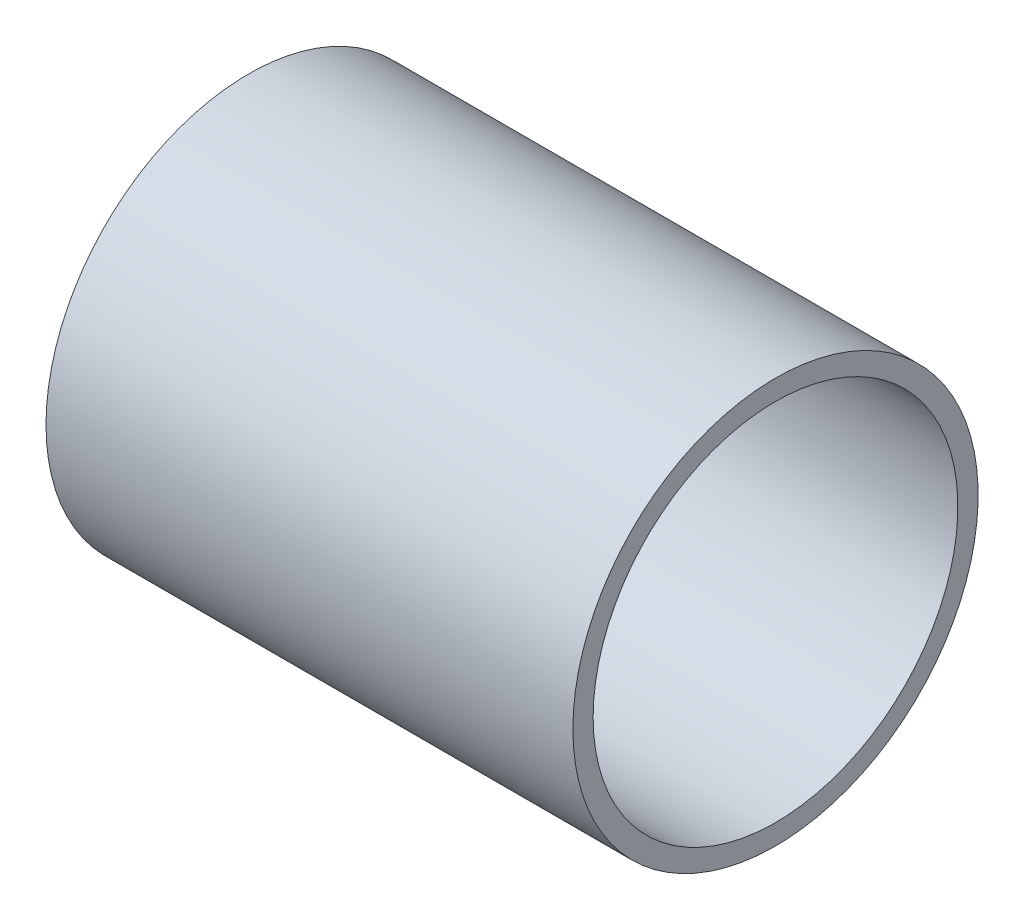
ISO-10303-21;
HEADER;
FILE_DESCRIPTION(('STEP AP214'),'2;1');
FILE_NAME('part.step','',(''),(''),'','','');
FILE_SCHEMA(('AUTOMOTIVE_DESIGN { 1 0 10303 214 1 1 1 1 }'));
ENDSEC;
DATA;
#1=APPLICATION_CONTEXT('core data for automotive mechanical design processes');
#2=APPLICATION_PROTOCOL_DEFINITION('international standard','automotive_design',2000,#1);
#3=PRODUCT_CONTEXT('',#1,'mechanical');
#4=PRODUCT('Part','Part','',(#3));
#5=PRODUCT_RELATED_PRODUCT_CATEGORY('part','',(#4));
#6=PRODUCT_DEFINITION_FORMATION('','',#4);
#7=PRODUCT_DEFINITION_CONTEXT('part definition',#1,'design');
#8=PRODUCT_DEFINITION('design','',#6,#7);
#9=PRODUCT_DEFINITION_SHAPE('','',#8);
#10=(LENGTH_UNIT() NAMED_UNIT(*) SI_UNIT(.MILLI.,.METRE.));
#11=(NAMED_UNIT(*) PLANE_ANGLE_UNIT() SI_UNIT($,.RADIAN.));
#12=(NAMED_UNIT(*) SI_UNIT($,.STERADIAN.) SOLID_ANGLE_UNIT());
#13=UNCERTAINTY_MEASURE_WITH_UNIT(LENGTH_MEASURE(1.E-05),#10,'distance_accuracy_value','');
#14=(GEOMETRIC_REPRESENTATION_CONTEXT(3) GLOBAL_UNCERTAINTY_ASSIGNED_CONTEXT((#13)) GLOBAL_UNIT_ASSIGNED_CONTEXT((#10,
#11,#12)) REPRESENTATION_CONTEXT('',''));
#15=CARTESIAN_POINT('',(0.,0.,0.));
#16=DIRECTION('',(0.,0.,1.));
#17=DIRECTION('',(1.,0.,0.));
#18=AXIS2_PLACEMENT_3D('',#15,#16,#17);
#19=CARTESIAN_POINT('',(167.4495,0.,0.));
#20=DIRECTION('',(-1.,0.,0.));
#21=DIRECTION('',(0.,0.,1.));
#22=AXIS2_PLACEMENT_3D('',#19,#20,#21);
#23=CYLINDRICAL_SURFACE('',#22,15.875);
#24=CARTESIAN_POINT('',(-126.1745,0.,0.));
#25=DIRECTION('',(-1.,0.,0.));
#26=DIRECTION('',(0.,0.,1.));
#27=AXIS2_PLACEMENT_3D('',#24,#25,#26);
#28=CIRCLE('',#27,15.875);
#29=CARTESIAN_POINT('',(-126.1745,0.,15.875));
#30=VERTEX_POINT('',#29);
#31=EDGE_CURVE('E48',#30,#30,#28,.T.);
#32=ORIENTED_EDGE('',*,*,#31,.T.);
#33=EDGE_LOOP('',(#32));
#34=FACE_BOUND('',#33,.T.);
#35=CARTESIAN_POINT('',(-167.4495,0.,0.));
#36=DIRECTION('',(1.,0.,0.));
#37=DIRECTION('',(0.,0.,-1.));
#38=AXIS2_PLACEMENT_3D('',#35,#36,#37);
#39=CIRCLE('',#38,15.875);
#40=CARTESIAN_POINT('',(-167.4495,0.,-15.875));
#41=VERTEX_POINT('',#40);
#42=EDGE_CURVE('E10',#41,#41,#39,.T.);
#43=ORIENTED_EDGE('',*,*,#42,.T.);
#44=EDGE_LOOP('',(#43));
#45=FACE_BOUND('',#44,.T.);
#46=ADVANCED_FACE('F37',(#34,#45),#23,.T.);
#47=CARTESIAN_POINT('',(-167.4495,0.,0.));
#48=DIRECTION('',(1.,0.,0.));
#49=DIRECTION('',(0.,0.,-1.));
#50=AXIS2_PLACEMENT_3D('',#47,#48,#49);
#51=PLANE('',#50);
#52=ORIENTED_EDGE('',*,*,#42,.F.);
#53=EDGE_LOOP('',(#52));
#54=FACE_BOUND('',#53,.T.);
#55=CARTESIAN_POINT('',(-167.4495,0.,0.));
#56=DIRECTION('',(1.,0.,0.));
#57=DIRECTION('',(0.,0.,-1.));
#58=AXIS2_PLACEMENT_3D('',#55,#56,#57);
#59=CIRCLE('',#58,14.2875);
#60=CARTESIAN_POINT('',(-167.4495,0.,-14.2875));
#61=VERTEX_POINT('',#60);
#62=EDGE_CURVE('E44',#61,#61,#59,.T.);
#63=ORIENTED_EDGE('',*,*,#62,.T.);
#64=EDGE_LOOP('',(#63));
#65=FACE_BOUND('',#64,.T.);
#66=ADVANCED_FACE('F63',(#54,#65),#51,.F.);
#67=CARTESIAN_POINT('',(167.4495,0.,0.));
#68=DIRECTION('',(-1.,0.,0.));
#69=DIRECTION('',(0.,0.,1.));
#70=AXIS2_PLACEMENT_3D('',#67,#68,#69);
#71=CYLINDRICAL_SURFACE('',#70,14.2875);
#72=CARTESIAN_POINT('',(-126.1745,0.,0.));
#73=DIRECTION('',(-1.,0.,0.));
#74=DIRECTION('',(0.,0.,1.));
#75=AXIS2_PLACEMENT_3D('',#72,#73,#74);
#76=CIRCLE('',#75,14.2875);
#77=CARTESIAN_POINT('',(-126.1745,0.,14.2875));
#78=VERTEX_POINT('',#77);
#79=EDGE_CURVE('E40',#78,#78,#76,.T.);
#80=ORIENTED_EDGE('',*,*,#79,.F.);
#81=EDGE_LOOP('',(#80));
#82=FACE_BOUND('',#81,.T.);
#83=ORIENTED_EDGE('',*,*,#62,.F.);
#84=EDGE_LOOP('',(#83));
#85=FACE_BOUND('',#84,.T.);
#86=ADVANCED_FACE('F60',(#82,#85),#71,.F.);
#87=CARTESIAN_POINT('',(-126.1745,-15.875,-15.875));
#88=DIRECTION('',(-1.,0.,0.));
#89=DIRECTION('',(0.,0.,1.));
#90=AXIS2_PLACEMENT_3D('',#87,#88,#89);
#91=PLANE('',#90);
#92=ORIENTED_EDGE('',*,*,#79,.T.);
#93=EDGE_LOOP('',(#92));
#94=FACE_BOUND('',#93,.T.);
#95=ORIENTED_EDGE('',*,*,#31,.F.);
#96=EDGE_LOOP('',(#95));
#97=FACE_BOUND('',#96,.T.);
#98=ADVANCED_FACE('F57',(#94,#97),#91,.F.);
#99=CLOSED_SHELL('',(#46,#66,#86,#98));
#100=MANIFOLD_SOLID_BREP('B2',#99);
#101=ADVANCED_BREP_SHAPE_REPRESENTATION('',(#18,#100),#14);
#102=SHAPE_DEFINITION_REPRESENTATION(#9,#101);
ENDSEC;
END-ISO-10303-21;
